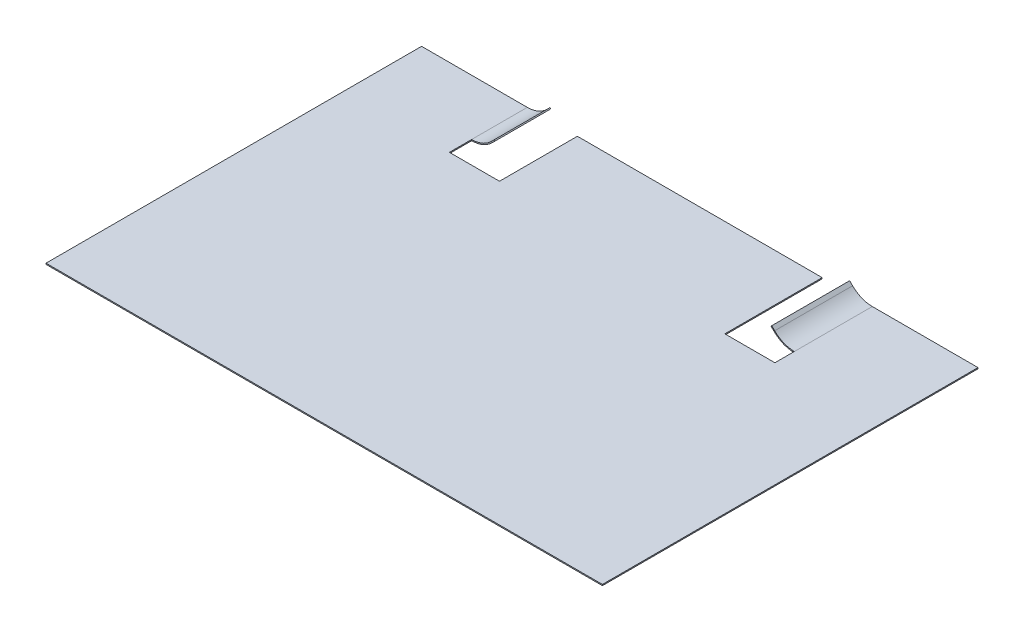
ISO-10303-21;
HEADER;
FILE_DESCRIPTION(('STEP AP214'),'2;1');
FILE_NAME('part.step','',(''),(''),'','','');
FILE_SCHEMA(('AUTOMOTIVE_DESIGN { 1 0 10303 214 1 1 1 1 }'));
ENDSEC;
DATA;
#1=APPLICATION_CONTEXT('core data for automotive mechanical design processes');
#2=APPLICATION_PROTOCOL_DEFINITION('international standard','automotive_design',2000,#1);
#3=PRODUCT_CONTEXT('',#1,'mechanical');
#4=PRODUCT('Part','Part','',(#3));
#5=PRODUCT_RELATED_PRODUCT_CATEGORY('part','',(#4));
#6=PRODUCT_DEFINITION_FORMATION('','',#4);
#7=PRODUCT_DEFINITION_CONTEXT('part definition',#1,'design');
#8=PRODUCT_DEFINITION('design','',#6,#7);
#9=PRODUCT_DEFINITION_SHAPE('','',#8);
#10=(LENGTH_UNIT() NAMED_UNIT(*) SI_UNIT(.MILLI.,.METRE.));
#11=(NAMED_UNIT(*) PLANE_ANGLE_UNIT() SI_UNIT($,.RADIAN.));
#12=(NAMED_UNIT(*) SI_UNIT($,.STERADIAN.) SOLID_ANGLE_UNIT());
#13=UNCERTAINTY_MEASURE_WITH_UNIT(LENGTH_MEASURE(1.E-05),#10,'distance_accuracy_value','');
#14=(GEOMETRIC_REPRESENTATION_CONTEXT(3) GLOBAL_UNCERTAINTY_ASSIGNED_CONTEXT((#13)) GLOBAL_UNIT_ASSIGNED_CONTEXT((#10,
#11,#12)) REPRESENTATION_CONTEXT('',''));
#15=CARTESIAN_POINT('',(0.,0.,0.));
#16=DIRECTION('',(0.,0.,1.));
#17=DIRECTION('',(1.,0.,0.));
#18=AXIS2_PLACEMENT_3D('',#15,#16,#17);
#19=CARTESIAN_POINT('',(0.,0.,0.));
#20=DIRECTION('',(0.,-1.,0.));
#21=DIRECTION('',(0.,0.,-1.));
#22=AXIS2_PLACEMENT_3D('',#19,#20,#21);
#23=PLANE('',#22);
#24=DIRECTION('',(0.,0.,-1.));
#25=VECTOR('',#24,1.);
#26=CARTESIAN_POINT('',(20.574,0.,0.));
#27=LINE('',#26,#25);
#28=CARTESIAN_POINT('',(20.574,0.,-12.7));
#29=VERTEX_POINT('',#28);
#30=CARTESIAN_POINT('',(20.574,0.,-13.589));
#31=VERTEX_POINT('',#30);
#32=EDGE_CURVE('E59',#29,#31,#27,.T.);
#33=ORIENTED_EDGE('',*,*,#32,.T.);
#34=DIRECTION('',(0.,0.,-1.));
#35=VECTOR('',#34,1.);
#36=CARTESIAN_POINT('',(20.574,0.,0.));
#37=LINE('',#36,#35);
#38=CARTESIAN_POINT('',(20.574,0.,-17.145));
#39=VERTEX_POINT('',#38);
#40=EDGE_CURVE('E51',#31,#39,#37,.T.);
#41=ORIENTED_EDGE('',*,*,#40,.T.);
#42=DIRECTION('',(1.,0.,0.));
#43=VECTOR('',#42,1.);
#44=CARTESIAN_POINT('',(0.,0.,-17.145));
#45=LINE('',#44,#43);
#46=CARTESIAN_POINT('',(25.4,0.,-17.145));
#47=VERTEX_POINT('',#46);
#48=EDGE_CURVE('E67',#47,#39,#45,.F.);
#49=ORIENTED_EDGE('',*,*,#48,.F.);
#50=DIRECTION('',(0.,0.,-1.));
#51=VECTOR('',#50,1.);
#52=CARTESIAN_POINT('',(25.4,0.,0.));
#53=LINE('',#52,#51);
#54=CARTESIAN_POINT('',(25.4,0.,0.));
#55=VERTEX_POINT('',#54);
#56=EDGE_CURVE('E308',#55,#47,#53,.T.);
#57=ORIENTED_EDGE('',*,*,#56,.F.);
#58=DIRECTION('',(1.,0.,0.));
#59=VECTOR('',#58,1.);
#60=CARTESIAN_POINT('',(0.,0.,0.));
#61=LINE('',#60,#59);
#62=CARTESIAN_POINT('',(0.,0.,0.));
#63=VERTEX_POINT('',#62);
#64=EDGE_CURVE('E303',#63,#55,#61,.T.);
#65=ORIENTED_EDGE('',*,*,#64,.F.);
#66=DIRECTION('',(0.,0.,-1.));
#67=VECTOR('',#66,1.);
#68=CARTESIAN_POINT('',(0.,0.,0.));
#69=LINE('',#68,#67);
#70=CARTESIAN_POINT('',(0.,0.,-17.145));
#71=VERTEX_POINT('',#70);
#72=EDGE_CURVE('E298',#71,#63,#69,.F.);
#73=ORIENTED_EDGE('',*,*,#72,.F.);
#74=DIRECTION('',(1.,0.,0.));
#75=VECTOR('',#74,1.);
#76=CARTESIAN_POINT('',(0.,0.,-17.145));
#77=LINE('',#76,#75);
#78=CARTESIAN_POINT('',(4.826,0.,-17.145));
#79=VERTEX_POINT('',#78);
#80=EDGE_CURVE('E280',#79,#71,#77,.F.);
#81=ORIENTED_EDGE('',*,*,#80,.F.);
#82=DIRECTION('',(0.,0.,-1.));
#83=VECTOR('',#82,1.);
#84=CARTESIAN_POINT('',(4.826,0.,0.));
#85=LINE('',#84,#83);
#86=CARTESIAN_POINT('',(4.826,0.,-14.605));
#87=VERTEX_POINT('',#86);
#88=EDGE_CURVE('E250',#87,#79,#85,.T.);
#89=ORIENTED_EDGE('',*,*,#88,.F.);
#90=DIRECTION('',(0.,0.,-1.));
#91=VECTOR('',#90,1.);
#92=CARTESIAN_POINT('',(4.826,0.,0.));
#93=LINE('',#92,#91);
#94=CARTESIAN_POINT('',(4.826,0.,-13.589));
#95=VERTEX_POINT('',#94);
#96=EDGE_CURVE('E274',#87,#95,#93,.F.);
#97=ORIENTED_EDGE('',*,*,#96,.T.);
#98=DIRECTION('',(1.,0.,0.));
#99=VECTOR('',#98,1.);
#100=CARTESIAN_POINT('',(0.,0.,-13.589));
#101=LINE('',#100,#99);
#102=CARTESIAN_POINT('',(7.112,0.,-13.589));
#103=VERTEX_POINT('',#102);
#104=EDGE_CURVE('E271',#95,#103,#101,.T.);
#105=ORIENTED_EDGE('',*,*,#104,.T.);
#106=DIRECTION('',(0.,0.,-1.));
#107=VECTOR('',#106,1.);
#108=CARTESIAN_POINT('',(7.112,0.,0.));
#109=LINE('',#108,#107);
#110=CARTESIAN_POINT('',(7.112,0.,-17.145));
#111=VERTEX_POINT('',#110);
#112=EDGE_CURVE('E268',#103,#111,#109,.T.);
#113=ORIENTED_EDGE('',*,*,#112,.T.);
#114=DIRECTION('',(1.,0.,0.));
#115=VECTOR('',#114,1.);
#116=CARTESIAN_POINT('',(0.,0.,-17.145));
#117=LINE('',#116,#115);
#118=CARTESIAN_POINT('',(18.288,0.,-17.145));
#119=VERTEX_POINT('',#118);
#120=EDGE_CURVE('E327',#119,#111,#117,.F.);
#121=ORIENTED_EDGE('',*,*,#120,.F.);
#122=DIRECTION('',(0.,0.,-1.));
#123=VECTOR('',#122,1.);
#124=CARTESIAN_POINT('',(18.288,0.,0.));
#125=LINE('',#124,#123);
#126=CARTESIAN_POINT('',(18.288,0.,-12.7));
#127=VERTEX_POINT('',#126);
#128=EDGE_CURVE('E265',#119,#127,#125,.F.);
#129=ORIENTED_EDGE('',*,*,#128,.T.);
#130=DIRECTION('',(1.,0.,0.));
#131=VECTOR('',#130,1.);
#132=CARTESIAN_POINT('',(0.,0.,-12.7));
#133=LINE('',#132,#131);
#134=EDGE_CURVE('E263',#127,#29,#133,.T.);
#135=ORIENTED_EDGE('',*,*,#134,.T.);
#136=EDGE_LOOP('',(#33,#41,#49,#57,#65,#73,#81,#89,#97,#105,#113,#121,#129,#135));
#137=FACE_BOUND('',#136,.T.);
#138=ADVANCED_FACE('F43',(#137),#23,.T.);
#139=CARTESIAN_POINT('',(0.,0.0508,-17.145));
#140=DIRECTION('',(0.,0.,1.));
#141=DIRECTION('',(-1.,0.,0.));
#142=AXIS2_PLACEMENT_3D('',#139,#140,#141);
#143=PLANE('',#142);
#144=ORIENTED_EDGE('',*,*,#48,.T.);
#145=DIRECTION('',(0.,1.,0.));
#146=VECTOR('',#145,1.);
#147=CARTESIAN_POINT('',(20.574,0.0508,-17.145));
#148=LINE('',#147,#146);
#149=CARTESIAN_POINT('',(20.574,0.0508,-17.145));
#150=VERTEX_POINT('',#149);
#151=EDGE_CURVE('E378',#39,#150,#148,.T.);
#152=ORIENTED_EDGE('',*,*,#151,.T.);
#153=DIRECTION('',(-1.,0.,0.));
#154=VECTOR('',#153,1.);
#155=CARTESIAN_POINT('',(0.,0.0508,-17.145));
#156=LINE('',#155,#154);
#157=CARTESIAN_POINT('',(25.4,0.0508,-17.145));
#158=VERTEX_POINT('',#157);
#159=EDGE_CURVE('E285',#158,#150,#156,.T.);
#160=ORIENTED_EDGE('',*,*,#159,.F.);
#161=DIRECTION('',(0.,1.,0.));
#162=VECTOR('',#161,1.);
#163=CARTESIAN_POINT('',(25.4,0.0508,-17.145));
#164=LINE('',#163,#162);
#165=EDGE_CURVE('E306',#47,#158,#164,.T.);
#166=ORIENTED_EDGE('',*,*,#165,.F.);
#167=EDGE_LOOP('',(#144,#152,#160,#166));
#168=FACE_BOUND('',#167,.T.);
#169=ADVANCED_FACE('F419',(#168),#143,.F.);
#170=CARTESIAN_POINT('',(5.85773612384719,0.556484899633362,-14.605));
#171=DIRECTION('',(0.,0.,1.));
#172=DIRECTION('',(-0.707106781186546,-0.707106781186549,0.));
#173=AXIS2_PLACEMENT_3D('',#170,#171,#172);
#174=PLANE('',#173);
#175=DIRECTION('',(-0.707106781186546,-0.707106781186549,0.));
#176=VECTOR('',#175,1.);
#177=CARTESIAN_POINT('',(5.85773612384719,0.556484899633362,-14.605));
#178=LINE('',#177,#176);
#179=CARTESIAN_POINT('',(5.85773612384719,0.556484899633362,-14.605));
#180=VERTEX_POINT('',#179);
#181=CARTESIAN_POINT('',(5.72402561210691,0.422774387893086,-14.605));
#182=VERTEX_POINT('',#181);
#183=EDGE_CURVE('E349',#180,#182,#178,.T.);
#184=ORIENTED_EDGE('',*,*,#183,.T.);
#185=DIRECTION('',(0.707106781186549,-0.707106781186546,0.));
#186=VECTOR('',#185,1.);
#187=CARTESIAN_POINT('',(5.72402561210691,0.422774387893086,-14.605));
#188=LINE('',#187,#186);
#189=CARTESIAN_POINT('',(5.75994663659119,0.386853363408809,-14.605));
#190=VERTEX_POINT('',#189);
#191=EDGE_CURVE('E366',#182,#190,#188,.T.);
#192=ORIENTED_EDGE('',*,*,#191,.T.);
#193=DIRECTION('',(0.707106781186546,0.707106781186549,0.));
#194=VECTOR('',#193,1.);
#195=CARTESIAN_POINT('',(1.62803549082363,-3.74505778235877,-14.605));
#196=LINE('',#195,#194);
#197=CARTESIAN_POINT('',(5.89365714833147,0.520563875149086,-14.605));
#198=VERTEX_POINT('',#197);
#199=EDGE_CURVE('E258',#198,#190,#196,.F.);
#200=ORIENTED_EDGE('',*,*,#199,.F.);
#201=DIRECTION('',(-0.707106781186549,0.707106781186546,0.));
#202=VECTOR('',#201,1.);
#203=CARTESIAN_POINT('',(5.85773612384719,0.556484899633362,-14.605));
#204=LINE('',#203,#202);
#205=EDGE_CURVE('E356',#198,#180,#204,.T.);
#206=ORIENTED_EDGE('',*,*,#205,.T.);
#207=EDGE_LOOP('',(#184,#192,#200,#206));
#208=FACE_BOUND('',#207,.T.);
#209=ADVANCED_FACE('F424',(#208),#174,.T.);
#210=CARTESIAN_POINT('',(1.59211446633935,-3.70913675787449,-17.145));
#211=DIRECTION('',(0.,0.,1.));
#212=DIRECTION('',(-0.707106781186546,-0.707106781186549,0.));
#213=AXIS2_PLACEMENT_3D('',#210,#211,#212);
#214=PLANE('',#213);
#215=DIRECTION('',(0.707106781186546,0.707106781186549,0.));
#216=VECTOR('',#215,1.);
#217=CARTESIAN_POINT('',(1.62803549082363,-3.74505778235877,-17.145));
#218=LINE('',#217,#216);
#219=CARTESIAN_POINT('',(5.89365714833147,0.520563875149086,-17.145));
#220=VERTEX_POINT('',#219);
#221=CARTESIAN_POINT('',(5.75994663659119,0.386853363408809,-17.145));
#222=VERTEX_POINT('',#221);
#223=EDGE_CURVE('E353',#220,#222,#218,.F.);
#224=ORIENTED_EDGE('',*,*,#223,.T.);
#225=DIRECTION('',(-0.707106781186549,0.707106781186546,0.));
#226=VECTOR('',#225,1.);
#227=CARTESIAN_POINT('',(5.72402561210691,0.422774387893086,-17.145));
#228=LINE('',#227,#226);
#229=CARTESIAN_POINT('',(5.72402561210691,0.422774387893086,-17.145));
#230=VERTEX_POINT('',#229);
#231=EDGE_CURVE('E361',#222,#230,#228,.T.);
#232=ORIENTED_EDGE('',*,*,#231,.T.);
#233=DIRECTION('',(-0.707106781186546,-0.707106781186549,0.));
#234=VECTOR('',#233,1.);
#235=CARTESIAN_POINT('',(1.59211446633935,-3.70913675787449,-17.145));
#236=LINE('',#235,#234);
#237=CARTESIAN_POINT('',(5.85773612384719,0.556484899633362,-17.145));
#238=VERTEX_POINT('',#237);
#239=EDGE_CURVE('E348',#238,#230,#236,.T.);
#240=ORIENTED_EDGE('',*,*,#239,.F.);
#241=DIRECTION('',(-0.707106781186549,0.707106781186546,0.));
#242=VECTOR('',#241,1.);
#243=CARTESIAN_POINT('',(5.85773612384719,0.556484899633362,-17.145));
#244=LINE('',#243,#242);
#245=EDGE_CURVE('E354',#220,#238,#244,.T.);
#246=ORIENTED_EDGE('',*,*,#245,.F.);
#247=EDGE_LOOP('',(#224,#232,#240,#246));
#248=FACE_BOUND('',#247,.T.);
#249=ADVANCED_FACE('F431',(#248),#214,.F.);
#250=CARTESIAN_POINT('',(1.62803549082363,-3.74505778235877,0.));
#251=DIRECTION('',(0.707106781186549,-0.707106781186546,0.));
#252=DIRECTION('',(0.,0.,-1.));
#253=AXIS2_PLACEMENT_3D('',#250,#251,#252);
#254=PLANE('',#253);
#255=ORIENTED_EDGE('',*,*,#199,.T.);
#256=DIRECTION('',(0.,0.,-1.));
#257=VECTOR('',#256,1.);
#258=CARTESIAN_POINT('',(5.75994663659119,0.386853363408809,0.));
#259=LINE('',#258,#257);
#260=EDGE_CURVE('E363',#190,#222,#259,.T.);
#261=ORIENTED_EDGE('',*,*,#260,.T.);
#262=ORIENTED_EDGE('',*,*,#223,.F.);
#263=DIRECTION('',(0.,0.,-1.));
#264=VECTOR('',#263,1.);
#265=CARTESIAN_POINT('',(5.89365714833147,0.520563875149086,0.));
#266=LINE('',#265,#264);
#267=EDGE_CURVE('E350',#220,#198,#266,.F.);
#268=ORIENTED_EDGE('',*,*,#267,.T.);
#269=EDGE_LOOP('',(#255,#261,#262,#268));
#270=FACE_BOUND('',#269,.T.);
#271=ADVANCED_FACE('F500',(#270),#254,.T.);
#272=CARTESIAN_POINT('',(5.85773612384719,0.556484899633362,-14.605));
#273=DIRECTION('',(0.707106781186546,0.707106781186549,0.));
#274=DIRECTION('',(0.,0.,1.));
#275=AXIS2_PLACEMENT_3D('',#272,#273,#274);
#276=PLANE('',#275);
#277=ORIENTED_EDGE('',*,*,#205,.F.);
#278=ORIENTED_EDGE('',*,*,#267,.F.);
#279=ORIENTED_EDGE('',*,*,#245,.T.);
#280=DIRECTION('',(0.,0.,1.));
#281=VECTOR('',#280,1.);
#282=CARTESIAN_POINT('',(5.85773612384719,0.556484899633362,-14.605));
#283=LINE('',#282,#281);
#284=EDGE_CURVE('E345',#238,#180,#283,.T.);
#285=ORIENTED_EDGE('',*,*,#284,.T.);
#286=EDGE_LOOP('',(#277,#278,#279,#285));
#287=FACE_BOUND('',#286,.T.);
#288=ADVANCED_FACE('F496',(#287),#276,.T.);
#289=CARTESIAN_POINT('',(1.59211446633935,-3.70913675787449,0.));
#290=DIRECTION('',(0.707106781186549,-0.707106781186546,0.));
#291=DIRECTION('',(0.,0.,-1.));
#292=AXIS2_PLACEMENT_3D('',#289,#290,#291);
#293=PLANE('',#292);
#294=DIRECTION('',(0.,0.,-1.));
#295=VECTOR('',#294,1.);
#296=CARTESIAN_POINT('',(5.72402561210691,0.422774387893086,0.));
#297=LINE('',#296,#295);
#298=EDGE_CURVE('E358',#182,#230,#297,.T.);
#299=ORIENTED_EDGE('',*,*,#298,.F.);
#300=ORIENTED_EDGE('',*,*,#183,.F.);
#301=ORIENTED_EDGE('',*,*,#284,.F.);
#302=ORIENTED_EDGE('',*,*,#239,.T.);
#303=EDGE_LOOP('',(#299,#300,#301,#302));
#304=FACE_BOUND('',#303,.T.);
#305=ADVANCED_FACE('F499',(#304),#293,.F.);
#306=CARTESIAN_POINT('',(4.826,0.0508,-13.589));
#307=DIRECTION('',(0.,0.,-1.));
#308=DIRECTION('',(1.,0.,0.));
#309=AXIS2_PLACEMENT_3D('',#306,#307,#308);
#310=PLANE('',#309);
#311=DIRECTION('',(0.,1.,0.));
#312=VECTOR('',#311,1.);
#313=CARTESIAN_POINT('',(7.112,0.0508,-13.589));
#314=LINE('',#313,#312);
#315=CARTESIAN_POINT('',(7.112,0.0508,-13.589));
#316=VERTEX_POINT('',#315);
#317=EDGE_CURVE('E333',#103,#316,#314,.T.);
#318=ORIENTED_EDGE('',*,*,#317,.F.);
#319=ORIENTED_EDGE('',*,*,#104,.F.);
#320=DIRECTION('',(0.,1.,0.));
#321=VECTOR('',#320,1.);
#322=CARTESIAN_POINT('',(4.826,0.0508,-13.589));
#323=LINE('',#322,#321);
#324=CARTESIAN_POINT('',(4.826,0.0508,-13.589));
#325=VERTEX_POINT('',#324);
#326=EDGE_CURVE('E338',#95,#325,#323,.T.);
#327=ORIENTED_EDGE('',*,*,#326,.T.);
#328=DIRECTION('',(1.,0.,0.));
#329=VECTOR('',#328,1.);
#330=CARTESIAN_POINT('',(4.826,0.0508,-13.589));
#331=LINE('',#330,#329);
#332=EDGE_CURVE('E335',#325,#316,#331,.T.);
#333=ORIENTED_EDGE('',*,*,#332,.T.);
#334=EDGE_LOOP('',(#318,#319,#327,#333));
#335=FACE_BOUND('',#334,.T.);
#336=ADVANCED_FACE('F450',(#335),#310,.T.);
#337=CARTESIAN_POINT('',(7.112,0.0508,-17.145));
#338=DIRECTION('',(-1.,0.,0.));
#339=DIRECTION('',(0.,0.,-1.));
#340=AXIS2_PLACEMENT_3D('',#337,#338,#339);
#341=PLANE('',#340);
#342=ORIENTED_EDGE('',*,*,#112,.F.);
#343=ORIENTED_EDGE('',*,*,#317,.T.);
#344=DIRECTION('',(0.,0.,-1.));
#345=VECTOR('',#344,1.);
#346=CARTESIAN_POINT('',(7.112,0.0508,-17.145));
#347=LINE('',#346,#345);
#348=CARTESIAN_POINT('',(7.112,0.0508,-17.145));
#349=VERTEX_POINT('',#348);
#350=EDGE_CURVE('E330',#316,#349,#347,.T.);
#351=ORIENTED_EDGE('',*,*,#350,.T.);
#352=DIRECTION('',(0.,1.,0.));
#353=VECTOR('',#352,1.);
#354=CARTESIAN_POINT('',(7.112,0.0508,-17.145));
#355=LINE('',#354,#353);
#356=EDGE_CURVE('E325',#111,#349,#355,.T.);
#357=ORIENTED_EDGE('',*,*,#356,.F.);
#358=EDGE_LOOP('',(#342,#343,#351,#357));
#359=FACE_BOUND('',#358,.T.);
#360=ADVANCED_FACE('F440',(#359),#341,.T.);
#361=DIRECTION('',(0.,1.,0.));
#362=VECTOR('',#361,1.);
#363=CARTESIAN_POINT('',(18.288,0.0508,-17.145));
#364=LINE('',#363,#362);
#365=CARTESIAN_POINT('',(18.288,0.0508,-17.145));
#366=VERTEX_POINT('',#365);
#367=EDGE_CURVE('E323',#119,#366,#364,.T.);
#368=ORIENTED_EDGE('',*,*,#367,.F.);
#369=ORIENTED_EDGE('',*,*,#120,.T.);
#370=ORIENTED_EDGE('',*,*,#356,.T.);
#371=EDGE_CURVE('E46',#366,#349,#156,.T.);
#372=ORIENTED_EDGE('',*,*,#371,.F.);
#373=EDGE_LOOP('',(#368,#369,#370,#372));
#374=FACE_BOUND('',#373,.T.);
#375=ADVANCED_FACE('F426',(#374),#143,.F.);
#376=CARTESIAN_POINT('',(18.288,0.0508,-17.145));
#377=DIRECTION('',(1.,0.,0.));
#378=DIRECTION('',(0.,0.,1.));
#379=AXIS2_PLACEMENT_3D('',#376,#377,#378);
#380=PLANE('',#379);
#381=DIRECTION('',(0.,1.,0.));
#382=VECTOR('',#381,1.);
#383=CARTESIAN_POINT('',(18.288,0.0508,-12.7));
#384=LINE('',#383,#382);
#385=CARTESIAN_POINT('',(18.288,0.0508,-12.7));
#386=VERTEX_POINT('',#385);
#387=EDGE_CURVE('E318',#127,#386,#384,.T.);
#388=ORIENTED_EDGE('',*,*,#387,.F.);
#389=ORIENTED_EDGE('',*,*,#128,.F.);
#390=ORIENTED_EDGE('',*,*,#367,.T.);
#391=DIRECTION('',(0.,0.,1.));
#392=VECTOR('',#391,1.);
#393=CARTESIAN_POINT('',(18.288,0.0508,-17.145));
#394=LINE('',#393,#392);
#395=EDGE_CURVE('E320',#366,#386,#394,.T.);
#396=ORIENTED_EDGE('',*,*,#395,.T.);
#397=EDGE_LOOP('',(#388,#389,#390,#396));
#398=FACE_BOUND('',#397,.T.);
#399=ADVANCED_FACE('F439',(#398),#380,.T.);
#400=CARTESIAN_POINT('',(18.288,0.0508,-12.7));
#401=DIRECTION('',(0.,0.,-1.));
#402=DIRECTION('',(1.,0.,0.));
#403=AXIS2_PLACEMENT_3D('',#400,#401,#402);
#404=PLANE('',#403);
#405=DIRECTION('',(0.,1.,0.));
#406=VECTOR('',#405,1.);
#407=CARTESIAN_POINT('',(20.574,0.0508,-12.7));
#408=LINE('',#407,#406);
#409=CARTESIAN_POINT('',(20.574,0.0508,-12.7));
#410=VERTEX_POINT('',#409);
#411=EDGE_CURVE('E313',#29,#410,#408,.T.);
#412=ORIENTED_EDGE('',*,*,#411,.F.);
#413=ORIENTED_EDGE('',*,*,#134,.F.);
#414=ORIENTED_EDGE('',*,*,#387,.T.);
#415=DIRECTION('',(1.,0.,0.));
#416=VECTOR('',#415,1.);
#417=CARTESIAN_POINT('',(18.288,0.0508,-12.7));
#418=LINE('',#417,#416);
#419=EDGE_CURVE('E315',#386,#410,#418,.T.);
#420=ORIENTED_EDGE('',*,*,#419,.T.);
#421=EDGE_LOOP('',(#412,#413,#414,#420));
#422=FACE_BOUND('',#421,.T.);
#423=ADVANCED_FACE('F446',(#422),#404,.T.);
#424=CARTESIAN_POINT('',(20.574,0.0508,-13.589));
#425=DIRECTION('',(-1.,0.,0.));
#426=DIRECTION('',(0.,0.,-1.));
#427=AXIS2_PLACEMENT_3D('',#424,#425,#426);
#428=PLANE('',#427);
#429=DIRECTION('',(0.,1.,0.));
#430=VECTOR('',#429,1.);
#431=CARTESIAN_POINT('',(20.574,0.0508,-13.589));
#432=LINE('',#431,#430);
#433=CARTESIAN_POINT('',(20.574,0.0507999999999997,-13.589));
#434=VERTEX_POINT('',#433);
#435=EDGE_CURVE('E12',#31,#434,#432,.T.);
#436=ORIENTED_EDGE('',*,*,#435,.F.);
#437=ORIENTED_EDGE('',*,*,#32,.F.);
#438=ORIENTED_EDGE('',*,*,#411,.T.);
#439=DIRECTION('',(0.,0.,-1.));
#440=VECTOR('',#439,1.);
#441=CARTESIAN_POINT('',(20.574,0.0508,-13.589));
#442=LINE('',#441,#440);
#443=EDGE_CURVE('E311',#410,#434,#442,.T.);
#444=ORIENTED_EDGE('',*,*,#443,.T.);
#445=EDGE_LOOP('',(#436,#437,#438,#444));
#446=FACE_BOUND('',#445,.T.);
#447=ADVANCED_FACE('F463',(#446),#428,.T.);
#448=CARTESIAN_POINT('',(25.4,0.0508,0.));
#449=DIRECTION('',(-1.,0.,0.));
#450=DIRECTION('',(0.,0.,-1.));
#451=AXIS2_PLACEMENT_3D('',#448,#449,#450);
#452=PLANE('',#451);
#453=DIRECTION('',(0.,1.,0.));
#454=VECTOR('',#453,1.);
#455=CARTESIAN_POINT('',(25.4,0.0508,0.));
#456=LINE('',#455,#454);
#457=CARTESIAN_POINT('',(25.4,0.0508,0.));
#458=VERTEX_POINT('',#457);
#459=EDGE_CURVE('E301',#55,#458,#456,.T.);
#460=ORIENTED_EDGE('',*,*,#459,.F.);
#461=ORIENTED_EDGE('',*,*,#56,.T.);
#462=ORIENTED_EDGE('',*,*,#165,.T.);
#463=DIRECTION('',(0.,0.,-1.));
#464=VECTOR('',#463,1.);
#465=CARTESIAN_POINT('',(25.4,0.0508,0.));
#466=LINE('',#465,#464);
#467=EDGE_CURVE('E282',#458,#158,#466,.T.);
#468=ORIENTED_EDGE('',*,*,#467,.F.);
#469=EDGE_LOOP('',(#460,#461,#462,#468));
#470=FACE_BOUND('',#469,.T.);
#471=ADVANCED_FACE('F479',(#470),#452,.F.);
#472=CARTESIAN_POINT('',(0.,0.0508,0.));
#473=DIRECTION('',(0.,0.,-1.));
#474=DIRECTION('',(1.,0.,0.));
#475=AXIS2_PLACEMENT_3D('',#472,#473,#474);
#476=PLANE('',#475);
#477=DIRECTION('',(0.,1.,0.));
#478=VECTOR('',#477,1.);
#479=CARTESIAN_POINT('',(0.,0.0508,0.));
#480=LINE('',#479,#478);
#481=CARTESIAN_POINT('',(0.,0.0508,0.));
#482=VERTEX_POINT('',#481);
#483=EDGE_CURVE('E296',#63,#482,#480,.T.);
#484=ORIENTED_EDGE('',*,*,#483,.F.);
#485=ORIENTED_EDGE('',*,*,#64,.T.);
#486=ORIENTED_EDGE('',*,*,#459,.T.);
#487=DIRECTION('',(1.,0.,0.));
#488=VECTOR('',#487,1.);
#489=CARTESIAN_POINT('',(0.,0.0508,0.));
#490=LINE('',#489,#488);
#491=EDGE_CURVE('E286',#482,#458,#490,.T.);
#492=ORIENTED_EDGE('',*,*,#491,.F.);
#493=EDGE_LOOP('',(#484,#485,#486,#492));
#494=FACE_BOUND('',#493,.T.);
#495=ADVANCED_FACE('F477',(#494),#476,.F.);
#496=CARTESIAN_POINT('',(0.,0.0508,0.));
#497=DIRECTION('',(1.,0.,0.));
#498=DIRECTION('',(0.,0.,1.));
#499=AXIS2_PLACEMENT_3D('',#496,#497,#498);
#500=PLANE('',#499);
#501=DIRECTION('',(0.,1.,0.));
#502=VECTOR('',#501,1.);
#503=CARTESIAN_POINT('',(0.,0.0508,-17.145));
#504=LINE('',#503,#502);
#505=CARTESIAN_POINT('',(0.,0.0508,-17.145));
#506=VERTEX_POINT('',#505);
#507=EDGE_CURVE('E277',#71,#506,#504,.T.);
#508=ORIENTED_EDGE('',*,*,#507,.F.);
#509=ORIENTED_EDGE('',*,*,#72,.T.);
#510=ORIENTED_EDGE('',*,*,#483,.T.);
#511=DIRECTION('',(0.,0.,1.));
#512=VECTOR('',#511,1.);
#513=CARTESIAN_POINT('',(0.,0.0508,0.));
#514=LINE('',#513,#512);
#515=EDGE_CURVE('E289',#506,#482,#514,.T.);
#516=ORIENTED_EDGE('',*,*,#515,.F.);
#517=EDGE_LOOP('',(#508,#509,#510,#516));
#518=FACE_BOUND('',#517,.T.);
#519=ADVANCED_FACE('F474',(#518),#500,.F.);
#520=CARTESIAN_POINT('',(0.,0.0508,0.));
#521=DIRECTION('',(0.,-1.,0.));
#522=DIRECTION('',(0.,0.,-1.));
#523=AXIS2_PLACEMENT_3D('',#520,#521,#522);
#524=PLANE('',#523);
#525=DIRECTION('',(0.,0.,-1.));
#526=VECTOR('',#525,1.);
#527=CARTESIAN_POINT('',(20.574,0.0508,0.));
#528=LINE('',#527,#526);
#529=EDGE_CURVE('E369',#434,#150,#528,.T.);
#530=ORIENTED_EDGE('',*,*,#529,.F.);
#531=ORIENTED_EDGE('',*,*,#443,.F.);
#532=ORIENTED_EDGE('',*,*,#419,.F.);
#533=ORIENTED_EDGE('',*,*,#395,.F.);
#534=ORIENTED_EDGE('',*,*,#371,.T.);
#535=ORIENTED_EDGE('',*,*,#350,.F.);
#536=ORIENTED_EDGE('',*,*,#332,.F.);
#537=DIRECTION('',(0.,0.,1.));
#538=VECTOR('',#537,1.);
#539=CARTESIAN_POINT('',(4.826,0.0508,-14.605));
#540=LINE('',#539,#538);
#541=CARTESIAN_POINT('',(4.826,0.0508,-14.605));
#542=VERTEX_POINT('',#541);
#543=EDGE_CURVE('E255',#542,#325,#540,.T.);
#544=ORIENTED_EDGE('',*,*,#543,.F.);
#545=DIRECTION('',(0.,0.,-1.));
#546=VECTOR('',#545,1.);
#547=CARTESIAN_POINT('',(4.826,0.0508,0.));
#548=LINE('',#547,#546);
#549=CARTESIAN_POINT('',(4.826,0.0508000000000002,-17.145));
#550=VERTEX_POINT('',#549);
#551=EDGE_CURVE('E293',#542,#550,#548,.T.);
#552=ORIENTED_EDGE('',*,*,#551,.T.);
#553=EDGE_CURVE('E292',#550,#506,#156,.T.);
#554=ORIENTED_EDGE('',*,*,#553,.T.);
#555=ORIENTED_EDGE('',*,*,#515,.T.);
#556=ORIENTED_EDGE('',*,*,#491,.T.);
#557=ORIENTED_EDGE('',*,*,#467,.T.);
#558=ORIENTED_EDGE('',*,*,#159,.T.);
#559=EDGE_LOOP('',(#530,#531,#532,#533,#534,#535,#536,#544,#552,#554,#555,#556,#557,#558));
#560=FACE_BOUND('',#559,.T.);
#561=ADVANCED_FACE('F437',(#560),#524,.F.);
#562=DIRECTION('',(0.,1.,0.));
#563=VECTOR('',#562,1.);
#564=CARTESIAN_POINT('',(4.826,0.0508,-17.145));
#565=LINE('',#564,#563);
#566=EDGE_CURVE('E340',#79,#550,#565,.T.);
#567=ORIENTED_EDGE('',*,*,#566,.F.);
#568=ORIENTED_EDGE('',*,*,#80,.T.);
#569=ORIENTED_EDGE('',*,*,#507,.T.);
#570=ORIENTED_EDGE('',*,*,#553,.F.);
#571=EDGE_LOOP('',(#567,#568,#569,#570));
#572=FACE_BOUND('',#571,.T.);
#573=ADVANCED_FACE('F425',(#572),#143,.F.);
#574=CARTESIAN_POINT('',(4.826,0.0508,-14.605));
#575=DIRECTION('',(1.,0.,0.));
#576=DIRECTION('',(0.,0.,1.));
#577=AXIS2_PLACEMENT_3D('',#574,#575,#576);
#578=PLANE('',#577);
#579=ORIENTED_EDGE('',*,*,#326,.F.);
#580=ORIENTED_EDGE('',*,*,#96,.F.);
#581=DIRECTION('',(0.,1.,0.));
#582=VECTOR('',#581,1.);
#583=CARTESIAN_POINT('',(4.826,0.0508,-14.605));
#584=LINE('',#583,#582);
#585=EDGE_CURVE('E259',#87,#542,#584,.T.);
#586=ORIENTED_EDGE('',*,*,#585,.T.);
#587=ORIENTED_EDGE('',*,*,#543,.T.);
#588=EDGE_LOOP('',(#579,#580,#586,#587));
#589=FACE_BOUND('',#588,.T.);
#590=ADVANCED_FACE('F436',(#589),#578,.T.);
#591=CARTESIAN_POINT('',(4.826,1.3208,-14.605));
#592=DIRECTION('',(0.,0.,-1.));
#593=DIRECTION('',(-1.,0.,0.));
#594=AXIS2_PLACEMENT_3D('',#591,#592,#593);
#595=PLANE('',#594);
#596=ORIENTED_EDGE('',*,*,#585,.F.);
#597=CARTESIAN_POINT('',(4.826,1.3208,-14.605));
#598=DIRECTION('',(0.,0.,-1.));
#599=DIRECTION('',(-1.,0.,0.));
#600=AXIS2_PLACEMENT_3D('',#597,#598,#599);
#601=CIRCLE('',#600,1.3208);
#602=EDGE_CURVE('E238',#87,#190,#601,.F.);
#603=ORIENTED_EDGE('',*,*,#602,.T.);
#604=ORIENTED_EDGE('',*,*,#191,.F.);
#605=CARTESIAN_POINT('',(4.826,1.3208,-14.605));
#606=DIRECTION('',(0.,0.,1.));
#607=DIRECTION('',(-1.,0.,0.));
#608=AXIS2_PLACEMENT_3D('',#605,#606,#607);
#609=CIRCLE('',#608,1.27);
#610=EDGE_CURVE('E243',#542,#182,#609,.T.);
#611=ORIENTED_EDGE('',*,*,#610,.F.);
#612=EDGE_LOOP('',(#596,#603,#604,#611));
#613=FACE_BOUND('',#612,.T.);
#614=ADVANCED_FACE('F494',(#613),#595,.F.);
#615=CARTESIAN_POINT('',(4.826,1.3208,-17.145));
#616=DIRECTION('',(0.,0.,1.));
#617=DIRECTION('',(1.,0.,0.));
#618=AXIS2_PLACEMENT_3D('',#615,#616,#617);
#619=PLANE('',#618);
#620=ORIENTED_EDGE('',*,*,#231,.F.);
#621=CARTESIAN_POINT('',(4.826,1.3208,-17.145));
#622=DIRECTION('',(0.,0.,-1.));
#623=DIRECTION('',(-1.,0.,0.));
#624=AXIS2_PLACEMENT_3D('',#621,#622,#623);
#625=CIRCLE('',#624,1.3208);
#626=EDGE_CURVE('E247',#222,#79,#625,.T.);
#627=ORIENTED_EDGE('',*,*,#626,.T.);
#628=ORIENTED_EDGE('',*,*,#566,.T.);
#629=CARTESIAN_POINT('',(4.826,1.3208,-17.145));
#630=DIRECTION('',(0.,0.,-1.));
#631=DIRECTION('',(-1.,0.,0.));
#632=AXIS2_PLACEMENT_3D('',#629,#630,#631);
#633=CIRCLE('',#632,1.27);
#634=EDGE_CURVE('E246',#230,#550,#633,.T.);
#635=ORIENTED_EDGE('',*,*,#634,.F.);
#636=EDGE_LOOP('',(#620,#627,#628,#635));
#637=FACE_BOUND('',#636,.T.);
#638=ADVANCED_FACE('F633',(#637),#619,.F.);
#639=CARTESIAN_POINT('',(4.826,1.3208,-13.1383427090468));
#640=DIRECTION('',(0.,0.,-1.));
#641=DIRECTION('',(-1.,0.,0.));
#642=AXIS2_PLACEMENT_3D('',#639,#640,#641);
#643=CYLINDRICAL_SURFACE('',#642,1.27);
#644=ORIENTED_EDGE('',*,*,#634,.T.);
#645=ORIENTED_EDGE('',*,*,#551,.F.);
#646=ORIENTED_EDGE('',*,*,#610,.T.);
#647=ORIENTED_EDGE('',*,*,#298,.T.);
#648=EDGE_LOOP('',(#644,#645,#646,#647));
#649=FACE_BOUND('',#648,.T.);
#650=ADVANCED_FACE('F624',(#649),#643,.F.);
#651=CARTESIAN_POINT('',(4.826,1.3208,-13.1383427090468));
#652=DIRECTION('',(0.,0.,-1.));
#653=DIRECTION('',(-1.,0.,0.));
#654=AXIS2_PLACEMENT_3D('',#651,#652,#653);
#655=CYLINDRICAL_SURFACE('',#654,1.3208);
#656=ORIENTED_EDGE('',*,*,#626,.F.);
#657=ORIENTED_EDGE('',*,*,#260,.F.);
#658=ORIENTED_EDGE('',*,*,#602,.F.);
#659=ORIENTED_EDGE('',*,*,#88,.T.);
#660=EDGE_LOOP('',(#656,#657,#658,#659));
#661=FACE_BOUND('',#660,.T.);
#662=ADVANCED_FACE('F525',(#661),#655,.T.);
#663=CARTESIAN_POINT('',(20.574,1.3208,-13.589));
#664=DIRECTION('',(0.,0.,-1.));
#665=DIRECTION('',(-1.,0.,0.));
#666=AXIS2_PLACEMENT_3D('',#663,#664,#665);
#667=PLANE('',#666);
#668=DIRECTION('',(-0.707106781186549,-0.707106781186546,0.));
#669=VECTOR('',#668,1.);
#670=CARTESIAN_POINT('',(19.6759743878931,0.422774387893086,-13.589));
#671=LINE('',#670,#669);
#672=CARTESIAN_POINT('',(19.6759743878931,0.422774387893086,-13.589));
#673=VERTEX_POINT('',#672);
#674=CARTESIAN_POINT('',(19.6400533634088,0.386853363408809,-13.589));
#675=VERTEX_POINT('',#674);
#676=EDGE_CURVE('E201',#673,#675,#671,.T.);
#677=ORIENTED_EDGE('',*,*,#676,.T.);
#678=CARTESIAN_POINT('',(20.574,1.3208,-13.589));
#679=DIRECTION('',(0.,0.,1.));
#680=DIRECTION('',(1.,0.,0.));
#681=AXIS2_PLACEMENT_3D('',#678,#679,#680);
#682=CIRCLE('',#681,1.3208);
#683=EDGE_CURVE('E205',#675,#31,#682,.T.);
#684=ORIENTED_EDGE('',*,*,#683,.T.);
#685=ORIENTED_EDGE('',*,*,#435,.T.);
#686=CARTESIAN_POINT('',(20.574,1.3208,-13.589));
#687=DIRECTION('',(0.,0.,1.));
#688=DIRECTION('',(-1.,0.,0.));
#689=AXIS2_PLACEMENT_3D('',#686,#687,#688);
#690=CIRCLE('',#689,1.27);
#691=EDGE_CURVE('E231',#673,#434,#690,.T.);
#692=ORIENTED_EDGE('',*,*,#691,.F.);
#693=EDGE_LOOP('',(#677,#684,#685,#692));
#694=FACE_BOUND('',#693,.T.);
#695=ADVANCED_FACE('F399',(#694),#667,.F.);
#696=CARTESIAN_POINT('',(20.574,1.3208,-17.145));
#697=DIRECTION('',(0.,0.,1.));
#698=DIRECTION('',(1.,0.,0.));
#699=AXIS2_PLACEMENT_3D('',#696,#697,#698);
#700=PLANE('',#699);
#701=CARTESIAN_POINT('',(20.574,1.3208,-17.145));
#702=DIRECTION('',(0.,0.,1.));
#703=DIRECTION('',(1.,0.,0.));
#704=AXIS2_PLACEMENT_3D('',#701,#702,#703);
#705=CIRCLE('',#704,1.3208);
#706=CARTESIAN_POINT('',(19.6400533634088,0.386853363408809,-17.145));
#707=VERTEX_POINT('',#706);
#708=EDGE_CURVE('E235',#39,#707,#705,.F.);
#709=ORIENTED_EDGE('',*,*,#708,.T.);
#710=DIRECTION('',(0.707106781186549,0.707106781186546,0.));
#711=VECTOR('',#710,1.);
#712=CARTESIAN_POINT('',(19.6759743878931,0.422774387893086,-17.145));
#713=LINE('',#712,#711);
#714=CARTESIAN_POINT('',(19.6759743878931,0.422774387893086,-17.145));
#715=VERTEX_POINT('',#714);
#716=EDGE_CURVE('E214',#707,#715,#713,.T.);
#717=ORIENTED_EDGE('',*,*,#716,.T.);
#718=CARTESIAN_POINT('',(20.574,1.3208,-17.145));
#719=DIRECTION('',(0.,0.,-1.));
#720=DIRECTION('',(-1.,0.,0.));
#721=AXIS2_PLACEMENT_3D('',#718,#719,#720);
#722=CIRCLE('',#721,1.27);
#723=EDGE_CURVE('E234',#150,#715,#722,.T.);
#724=ORIENTED_EDGE('',*,*,#723,.F.);
#725=ORIENTED_EDGE('',*,*,#151,.F.);
#726=EDGE_LOOP('',(#709,#717,#724,#725));
#727=FACE_BOUND('',#726,.T.);
#728=ADVANCED_FACE('F388',(#727),#700,.F.);
#729=CARTESIAN_POINT('',(20.574,1.3208,-19.0660308363309));
#730=DIRECTION('',(0.,0.,1.));
#731=DIRECTION('',(1.,0.,0.));
#732=AXIS2_PLACEMENT_3D('',#729,#730,#731);
#733=CYLINDRICAL_SURFACE('',#732,1.27);
#734=ORIENTED_EDGE('',*,*,#529,.T.);
#735=ORIENTED_EDGE('',*,*,#723,.T.);
#736=DIRECTION('',(0.,0.,-1.));
#737=VECTOR('',#736,1.);
#738=CARTESIAN_POINT('',(19.6759743878931,0.422774387893086,0.));
#739=LINE('',#738,#737);
#740=EDGE_CURVE('E220',#673,#715,#739,.T.);
#741=ORIENTED_EDGE('',*,*,#740,.F.);
#742=ORIENTED_EDGE('',*,*,#691,.T.);
#743=EDGE_LOOP('',(#734,#735,#741,#742));
#744=FACE_BOUND('',#743,.T.);
#745=ADVANCED_FACE('F401',(#744),#733,.F.);
#746=CARTESIAN_POINT('',(20.574,1.3208,-19.0660308363309));
#747=DIRECTION('',(0.,0.,1.));
#748=DIRECTION('',(1.,0.,0.));
#749=AXIS2_PLACEMENT_3D('',#746,#747,#748);
#750=CYLINDRICAL_SURFACE('',#749,1.3208);
#751=ORIENTED_EDGE('',*,*,#40,.F.);
#752=ORIENTED_EDGE('',*,*,#683,.F.);
#753=DIRECTION('',(0.,0.,-1.));
#754=VECTOR('',#753,1.);
#755=CARTESIAN_POINT('',(19.6400533634088,0.386853363408809,0.));
#756=LINE('',#755,#754);
#757=EDGE_CURVE('E227',#675,#707,#756,.T.);
#758=ORIENTED_EDGE('',*,*,#757,.T.);
#759=ORIENTED_EDGE('',*,*,#708,.F.);
#760=EDGE_LOOP('',(#751,#752,#758,#759));
#761=FACE_BOUND('',#760,.T.);
#762=ADVANCED_FACE('F390',(#761),#750,.T.);
#763=CARTESIAN_POINT('',(19.5422638761528,0.556484899633359,-13.589));
#764=DIRECTION('',(-0.707106781186546,0.707106781186549,0.));
#765=DIRECTION('',(0.,0.,-1.));
#766=AXIS2_PLACEMENT_3D('',#763,#764,#765);
#767=PLANE('',#766);
#768=DIRECTION('',(0.707106781186549,0.707106781186546,0.));
#769=VECTOR('',#768,1.);
#770=CARTESIAN_POINT('',(19.5422638761528,0.556484899633359,-17.145));
#771=LINE('',#770,#769);
#772=CARTESIAN_POINT('',(19.5063428516685,0.520563875149082,-17.145));
#773=VERTEX_POINT('',#772);
#774=CARTESIAN_POINT('',(19.5422638761528,0.556484899633359,-17.145));
#775=VERTEX_POINT('',#774);
#776=EDGE_CURVE('E405',#773,#775,#771,.T.);
#777=ORIENTED_EDGE('',*,*,#776,.F.);
#778=DIRECTION('',(0.,0.,-1.));
#779=VECTOR('',#778,1.);
#780=CARTESIAN_POINT('',(19.5063428516685,0.520563875149082,0.));
#781=LINE('',#780,#779);
#782=CARTESIAN_POINT('',(19.5063428516685,0.520563875149082,-13.589));
#783=VERTEX_POINT('',#782);
#784=EDGE_CURVE('E206',#783,#773,#781,.T.);
#785=ORIENTED_EDGE('',*,*,#784,.F.);
#786=DIRECTION('',(0.707106781186549,0.707106781186546,0.));
#787=VECTOR('',#786,1.);
#788=CARTESIAN_POINT('',(19.5422638761528,0.556484899633359,-13.589));
#789=LINE('',#788,#787);
#790=CARTESIAN_POINT('',(19.5422638761528,0.556484899633359,-13.589));
#791=VERTEX_POINT('',#790);
#792=EDGE_CURVE('E198',#783,#791,#789,.T.);
#793=ORIENTED_EDGE('',*,*,#792,.T.);
#794=DIRECTION('',(0.,0.,-1.));
#795=VECTOR('',#794,1.);
#796=CARTESIAN_POINT('',(19.5422638761528,0.556484899633359,-13.589));
#797=LINE('',#796,#795);
#798=EDGE_CURVE('E212',#791,#775,#797,.T.);
#799=ORIENTED_EDGE('',*,*,#798,.T.);
#800=EDGE_LOOP('',(#777,#785,#793,#799));
#801=FACE_BOUND('',#800,.T.);
#802=ADVANCED_FACE('F211',(#801),#767,.T.);
#803=CARTESIAN_POINT('',(5.84737329152237,14.2513754842638,0.));
#804=DIRECTION('',(-0.707106781186549,-0.707106781186546,0.));
#805=DIRECTION('',(0.,0.,-1.));
#806=AXIS2_PLACEMENT_3D('',#803,#804,#805);
#807=PLANE('',#806);
#808=DIRECTION('',(-0.707106781186546,0.707106781186549,0.));
#809=VECTOR('',#808,1.);
#810=CARTESIAN_POINT('',(19.5422638761528,0.556484899633359,-13.589));
#811=LINE('',#810,#809);
#812=EDGE_CURVE('E195',#673,#791,#811,.T.);
#813=ORIENTED_EDGE('',*,*,#812,.F.);
#814=ORIENTED_EDGE('',*,*,#740,.T.);
#815=DIRECTION('',(-0.707106781186546,0.707106781186549,0.));
#816=VECTOR('',#815,1.);
#817=CARTESIAN_POINT('',(5.84737329152237,14.2513754842638,-17.145));
#818=LINE('',#817,#816);
#819=EDGE_CURVE('E218',#715,#775,#818,.T.);
#820=ORIENTED_EDGE('',*,*,#819,.T.);
#821=ORIENTED_EDGE('',*,*,#798,.F.);
#822=EDGE_LOOP('',(#813,#814,#820,#821));
#823=FACE_BOUND('',#822,.T.);
#824=ADVANCED_FACE('F216',(#823),#807,.F.);
#825=CARTESIAN_POINT('',(5.84737329152237,14.2513754842638,-17.145));
#826=DIRECTION('',(0.,0.,1.));
#827=DIRECTION('',(-0.707106781186546,0.707106781186549,0.));
#828=AXIS2_PLACEMENT_3D('',#825,#826,#827);
#829=PLANE('',#828);
#830=ORIENTED_EDGE('',*,*,#716,.F.);
#831=DIRECTION('',(0.707106781186546,-0.707106781186549,0.));
#832=VECTOR('',#831,1.);
#833=CARTESIAN_POINT('',(5.81145226703809,14.2154544597796,-17.145));
#834=LINE('',#833,#832);
#835=EDGE_CURVE('E395',#707,#773,#834,.F.);
#836=ORIENTED_EDGE('',*,*,#835,.T.);
#837=ORIENTED_EDGE('',*,*,#776,.T.);
#838=ORIENTED_EDGE('',*,*,#819,.F.);
#839=EDGE_LOOP('',(#830,#836,#837,#838));
#840=FACE_BOUND('',#839,.T.);
#841=ADVANCED_FACE('F404',(#840),#829,.F.);
#842=CARTESIAN_POINT('',(5.81145226703809,14.2154544597796,0.));
#843=DIRECTION('',(-0.707106781186549,-0.707106781186546,0.));
#844=DIRECTION('',(0.,0.,-1.));
#845=AXIS2_PLACEMENT_3D('',#842,#843,#844);
#846=PLANE('',#845);
#847=ORIENTED_EDGE('',*,*,#757,.F.);
#848=DIRECTION('',(0.707106781186546,-0.707106781186549,0.));
#849=VECTOR('',#848,1.);
#850=CARTESIAN_POINT('',(5.81145226703809,14.2154544597796,-13.589));
#851=LINE('',#850,#849);
#852=EDGE_CURVE('E394',#675,#783,#851,.F.);
#853=ORIENTED_EDGE('',*,*,#852,.T.);
#854=ORIENTED_EDGE('',*,*,#784,.T.);
#855=ORIENTED_EDGE('',*,*,#835,.F.);
#856=EDGE_LOOP('',(#847,#853,#854,#855));
#857=FACE_BOUND('',#856,.T.);
#858=ADVANCED_FACE('F393',(#857),#846,.T.);
#859=CARTESIAN_POINT('',(19.5422638761528,0.556484899633359,-13.589));
#860=DIRECTION('',(0.,0.,1.));
#861=DIRECTION('',(-0.707106781186546,0.707106781186549,0.));
#862=AXIS2_PLACEMENT_3D('',#859,#860,#861);
#863=PLANE('',#862);
#864=ORIENTED_EDGE('',*,*,#676,.F.);
#865=ORIENTED_EDGE('',*,*,#812,.T.);
#866=ORIENTED_EDGE('',*,*,#792,.F.);
#867=ORIENTED_EDGE('',*,*,#852,.F.);
#868=EDGE_LOOP('',(#864,#865,#866,#867));
#869=FACE_BOUND('',#868,.T.);
#870=ADVANCED_FACE('F197',(#869),#863,.T.);
#871=CLOSED_SHELL('',(#138,#169,#209,#249,#271,#288,#305,#336,#360,#375,#399,#423,#447,#471,
#495,#519,#561,#573,#590,#614,#638,#650,#662,#695,#728,#745,#762,#802,#824,#841,#858,#870));
#872=MANIFOLD_SOLID_BREP('B2',#871);
#873=ADVANCED_BREP_SHAPE_REPRESENTATION('',(#18,#872),#14);
#874=SHAPE_DEFINITION_REPRESENTATION(#9,#873);
ENDSEC;
END-ISO-10303-21;
